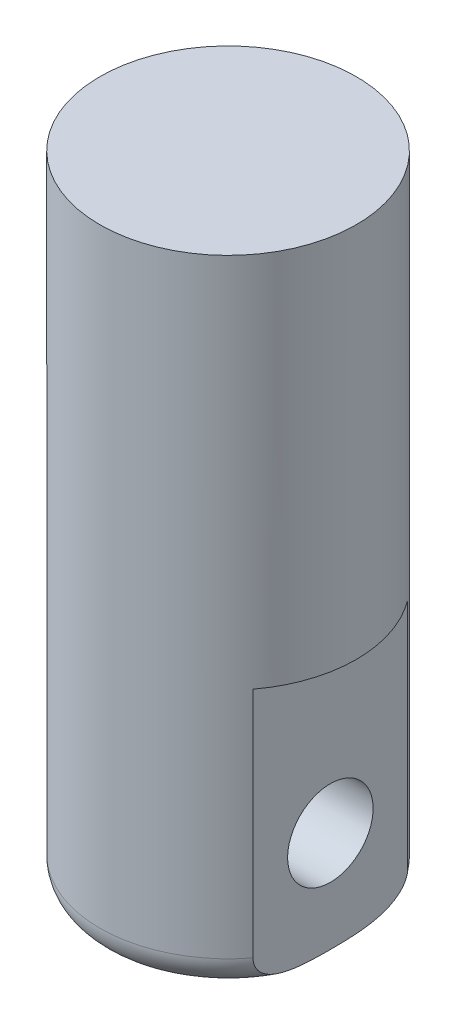
ISO-10303-21;
HEADER;
FILE_DESCRIPTION(('STEP AP214'),'2;1');
FILE_NAME('part.step','',(''),(''),'','','');
FILE_SCHEMA(('AUTOMOTIVE_DESIGN { 1 0 10303 214 1 1 1 1 }'));
ENDSEC;
DATA;
#1=APPLICATION_CONTEXT('core data for automotive mechanical design processes');
#2=APPLICATION_PROTOCOL_DEFINITION('international standard','automotive_design',2000,#1);
#3=PRODUCT_CONTEXT('',#1,'mechanical');
#4=PRODUCT('Part','Part','',(#3));
#5=PRODUCT_RELATED_PRODUCT_CATEGORY('part','',(#4));
#6=PRODUCT_DEFINITION_FORMATION('','',#4);
#7=PRODUCT_DEFINITION_CONTEXT('part definition',#1,'design');
#8=PRODUCT_DEFINITION('design','',#6,#7);
#9=PRODUCT_DEFINITION_SHAPE('','',#8);
#10=(LENGTH_UNIT() NAMED_UNIT(*) SI_UNIT(.MILLI.,.METRE.));
#11=(NAMED_UNIT(*) PLANE_ANGLE_UNIT() SI_UNIT($,.RADIAN.));
#12=(NAMED_UNIT(*) SI_UNIT($,.STERADIAN.) SOLID_ANGLE_UNIT());
#13=UNCERTAINTY_MEASURE_WITH_UNIT(LENGTH_MEASURE(1.E-05),#10,'distance_accuracy_value','');
#14=(GEOMETRIC_REPRESENTATION_CONTEXT(3) GLOBAL_UNCERTAINTY_ASSIGNED_CONTEXT((#13)) GLOBAL_UNIT_ASSIGNED_CONTEXT((#10,
#11,#12)) REPRESENTATION_CONTEXT('',''));
#15=CARTESIAN_POINT('',(0.,0.,0.));
#16=DIRECTION('',(0.,0.,1.));
#17=DIRECTION('',(1.,0.,0.));
#18=AXIS2_PLACEMENT_3D('',#15,#16,#17);
#19=CARTESIAN_POINT('',(0.,60.,0.));
#20=DIRECTION('',(0.,-1.,0.));
#21=DIRECTION('',(0.,0.,-1.));
#22=AXIS2_PLACEMENT_3D('',#19,#20,#21);
#23=CYLINDRICAL_SURFACE('',#22,12.);
#24=CARTESIAN_POINT('',(0.,24.7728953416858,0.));
#25=DIRECTION('',(0.,1.,0.));
#26=DIRECTION('',(0.,0.,1.));
#27=AXIS2_PLACEMENT_3D('',#24,#25,#26);
#28=CIRCLE('',#27,12.);
#29=CARTESIAN_POINT('',(9.57123656336734,24.7728953416858,7.2381924986878));
#30=VERTEX_POINT('',#29);
#31=CARTESIAN_POINT('',(9.57123656336734,24.7728953416858,-7.2381924986878));
#32=VERTEX_POINT('',#31);
#33=EDGE_CURVE('E13',#30,#32,#28,.T.);
#34=ORIENTED_EDGE('',*,*,#33,.T.);
#35=DIRECTION('',(0.,-1.,0.));
#36=VECTOR('',#35,1.);
#37=CARTESIAN_POINT('',(9.57123656336734,60.,-7.23819249868779));
#38=LINE('',#37,#36);
#39=CARTESIAN_POINT('',(9.57123656336733,3.,-7.2381924986878));
#40=VERTEX_POINT('',#39);
#41=EDGE_CURVE('E86',#32,#40,#38,.T.);
#42=ORIENTED_EDGE('',*,*,#41,.T.);
#43=CARTESIAN_POINT('',(0.,3.,0.));
#44=DIRECTION('',(0.,1.,0.));
#45=DIRECTION('',(0.,0.,1.));
#46=AXIS2_PLACEMENT_3D('',#43,#44,#45);
#47=CIRCLE('',#46,12.);
#48=CARTESIAN_POINT('',(-9.57123656336733,3.,-7.2381924986878));
#49=VERTEX_POINT('',#48);
#50=EDGE_CURVE('E68',#40,#49,#47,.T.);
#51=ORIENTED_EDGE('',*,*,#50,.T.);
#52=DIRECTION('',(0.,-1.,0.));
#53=VECTOR('',#52,1.);
#54=CARTESIAN_POINT('',(-9.57123656336734,60.,-7.23819249868779));
#55=LINE('',#54,#53);
#56=CARTESIAN_POINT('',(-9.57123656336734,24.7728953416858,-7.23819249868779));
#57=VERTEX_POINT('',#56);
#58=EDGE_CURVE('E106',#49,#57,#55,.F.);
#59=ORIENTED_EDGE('',*,*,#58,.T.);
#60=CARTESIAN_POINT('',(0.,24.7728953416858,0.));
#61=DIRECTION('',(0.,1.,0.));
#62=DIRECTION('',(0.,0.,1.));
#63=AXIS2_PLACEMENT_3D('',#60,#61,#62);
#64=CIRCLE('',#63,12.);
#65=CARTESIAN_POINT('',(-9.57123656336734,24.7728953416858,7.23819249868779));
#66=VERTEX_POINT('',#65);
#67=EDGE_CURVE('E122',#57,#66,#64,.T.);
#68=ORIENTED_EDGE('',*,*,#67,.T.);
#69=DIRECTION('',(0.,-1.,0.));
#70=VECTOR('',#69,1.);
#71=CARTESIAN_POINT('',(-9.57123656336734,60.,7.23819249868779));
#72=LINE('',#71,#70);
#73=CARTESIAN_POINT('',(-9.57123656336733,3.,7.2381924986878));
#74=VERTEX_POINT('',#73);
#75=EDGE_CURVE('E108',#66,#74,#72,.T.);
#76=ORIENTED_EDGE('',*,*,#75,.T.);
#77=CARTESIAN_POINT('',(9.57123656336733,3.,7.2381924986878));
#78=VERTEX_POINT('',#77);
#79=EDGE_CURVE('E100',#74,#78,#47,.T.);
#80=ORIENTED_EDGE('',*,*,#79,.T.);
#81=DIRECTION('',(0.,-1.,0.));
#82=VECTOR('',#81,1.);
#83=CARTESIAN_POINT('',(9.57123656336734,60.,7.23819249868779));
#84=LINE('',#83,#82);
#85=EDGE_CURVE('E60',#78,#30,#84,.F.);
#86=ORIENTED_EDGE('',*,*,#85,.T.);
#87=EDGE_LOOP('',(#34,#42,#51,#59,#68,#76,#80,#86));
#88=FACE_BOUND('',#87,.T.);
#89=CARTESIAN_POINT('',(0.,60.,0.));
#90=DIRECTION('',(0.,1.,0.));
#91=DIRECTION('',(0.,0.,1.));
#92=AXIS2_PLACEMENT_3D('',#89,#90,#91);
#93=CIRCLE('',#92,12.);
#94=CARTESIAN_POINT('',(0.,60.,12.));
#95=VERTEX_POINT('',#94);
#96=EDGE_CURVE('E110',#95,#95,#93,.T.);
#97=ORIENTED_EDGE('',*,*,#96,.F.);
#98=EDGE_LOOP('',(#97));
#99=FACE_BOUND('',#98,.T.);
#100=ADVANCED_FACE('F43',(#88,#99),#23,.T.);
#101=CARTESIAN_POINT('',(0.,60.,0.));
#102=DIRECTION('',(0.,1.,0.));
#103=DIRECTION('',(0.,0.,1.));
#104=AXIS2_PLACEMENT_3D('',#101,#102,#103);
#105=PLANE('',#104);
#106=ORIENTED_EDGE('',*,*,#96,.T.);
#107=EDGE_LOOP('',(#106));
#108=FACE_BOUND('',#107,.T.);
#109=ADVANCED_FACE('F132',(#108),#105,.T.);
#110=CARTESIAN_POINT('',(0.,0.,0.));
#111=DIRECTION('',(0.,1.,0.));
#112=DIRECTION('',(0.,0.,1.));
#113=AXIS2_PLACEMENT_3D('',#110,#111,#112);
#114=PLANE('',#113);
#115=CARTESIAN_POINT('',(0.,0.,0.));
#116=DIRECTION('',(0.,1.,0.));
#117=DIRECTION('',(0.,0.,1.));
#118=AXIS2_PLACEMENT_3D('',#115,#116,#117);
#119=CIRCLE('',#118,9.);
#120=CARTESIAN_POINT('',(0.,0.,9.));
#121=VERTEX_POINT('',#120);
#122=EDGE_CURVE('E114',#121,#121,#119,.F.);
#123=ORIENTED_EDGE('',*,*,#122,.T.);
#124=EDGE_LOOP('',(#123));
#125=FACE_BOUND('',#124,.T.);
#126=ADVANCED_FACE('F135',(#125),#114,.F.);
#127=CARTESIAN_POINT('',(0.,3.,0.));
#128=DIRECTION('',(0.,1.,0.));
#129=DIRECTION('',(0.,0.,1.));
#130=AXIS2_PLACEMENT_3D('',#127,#128,#129);
#131=TOROIDAL_SURFACE('',#130,9.,3.);
#132=CARTESIAN_POINT('',(9.57123656336733,0.0548873045887925,0.));
#133=CARTESIAN_POINT('',(9.57123656336733,0.0548869468945749,-0.155465034929481));
#134=CARTESIAN_POINT('',(9.57123656336733,0.0556147680681275,-0.310930133099451));
#135=CARTESIAN_POINT('',(9.57123656336733,0.058610709002801,-0.62184773540606));
#136=CARTESIAN_POINT('',(9.57123656336733,0.0608788458463625,-0.777300239383904));
#137=CARTESIAN_POINT('',(9.57123656336733,0.0672121364854791,-1.08822388517824));
#138=CARTESIAN_POINT('',(9.57123656336733,0.0712779133085758,-1.24369501475731));
#139=CARTESIAN_POINT('',(9.57123656336733,0.0816285158465251,-1.55457008641294));
#140=CARTESIAN_POINT('',(9.57123656336733,0.0879134028516704,-1.70997402651507));
#141=CARTESIAN_POINT('',(9.57123656336733,0.103276245255734,-2.02044593965249));
#142=CARTESIAN_POINT('',(9.57123656336733,0.112350572036839,-2.17551408712386));
#143=CARTESIAN_POINT('',(9.57123656336733,0.134033508303668,-2.48539847302015));
#144=CARTESIAN_POINT('',(9.57123656336733,0.146641868484907,-2.64021472843995));
#145=CARTESIAN_POINT('',(9.57123656336733,0.176279036230797,-2.94933060029504));
#146=CARTESIAN_POINT('',(9.57123656336733,0.193304951945146,-3.10363048807499));
#147=CARTESIAN_POINT('',(9.57123656336733,0.23282988250685,-3.41151750344136));
#148=CARTESIAN_POINT('',(9.57123656336733,0.255328006068026,-3.56510474295315));
#149=CARTESIAN_POINT('',(9.57123656336733,0.30074241429041,-3.83400419968946));
#150=CARTESIAN_POINT('',(9.57123656336733,0.322230575740359,-3.94955442035602));
#151=CARTESIAN_POINT('',(9.57123656336733,0.369643686131024,-4.17973425821697));
#152=CARTESIAN_POINT('',(9.57123656336733,0.395568890279045,-4.29436382206028));
#153=CARTESIAN_POINT('',(9.57123656336733,0.481056115865391,-4.63674663826659));
#154=CARTESIAN_POINT('',(9.57123656336733,0.548289047789931,-4.86273473418383));
#155=CARTESIAN_POINT('',(9.57123656336733,0.669394620667852,-5.19581672353117));
#156=CARTESIAN_POINT('',(9.57123656336733,0.713453557515262,-5.30648246857109));
#157=CARTESIAN_POINT('',(9.57123656336733,0.80920030673028,-5.52445069679091));
#158=CARTESIAN_POINT('',(9.57123656336733,0.860889877186831,-5.63175239797343));
#159=CARTESIAN_POINT('',(9.57123656336733,1.0285319995107,-5.94637714385166));
#160=CARTESIAN_POINT('',(9.57123656336733,1.15738658111845,-6.14738563068559));
#161=CARTESIAN_POINT('',(9.57123656336733,1.39081637504733,-6.43671801111573));
#162=CARTESIAN_POINT('',(9.57123656336733,1.48170174257977,-6.53611649147816));
#163=CARTESIAN_POINT('',(9.57123656336733,1.67717269858274,-6.72068413664232));
#164=CARTESIAN_POINT('',(9.57123656336733,1.78175762185569,-6.80585399187461));
#165=CARTESIAN_POINT('',(9.57123656336733,2.00546907953204,-6.95799869140096));
#166=CARTESIAN_POINT('',(9.57123656336733,2.12475342640024,-7.02474566261939));
#167=CARTESIAN_POINT('',(9.57123656336733,2.37426860925152,-7.13310714426173));
#168=CARTESIAN_POINT('',(9.57123656336733,2.50448044669186,-7.17476428520775));
#169=CARTESIAN_POINT('',(9.57123656336733,2.75158403542274,-7.22478501770622));
#170=CARTESIAN_POINT('',(9.57123656336733,2.86767866594206,-7.23709235136449));
#171=CARTESIAN_POINT('',(9.57123656336733,3.10005546404701,-7.23914881502486));
#172=CARTESIAN_POINT('',(9.57123656336733,3.21633753299819,-7.22890736899095));
#173=CARTESIAN_POINT('',(9.57123656336733,3.43130489371198,-7.18930968998276));
#174=CARTESIAN_POINT('',(9.57123656336733,3.53044683218177,-7.162353049238));
#175=CARTESIAN_POINT('',(9.57123656336733,3.7232865338967,-7.09337228616591));
#176=CARTESIAN_POINT('',(9.57123656336733,3.81698337974559,-7.05134563332673));
#177=CARTESIAN_POINT('',(9.57123656336733,4.02728987625577,-6.9383445281493));
#178=CARTESIAN_POINT('',(9.57123656336733,4.14122331365471,-6.86239298587672));
#179=CARTESIAN_POINT('',(9.57123656336733,4.35524319531788,-6.69299161072007));
#180=CARTESIAN_POINT('',(9.57123656336733,4.4553010163791,-6.59950651608131));
#181=CARTESIAN_POINT('',(9.57123656336733,4.6828352021093,-6.35543499253282));
#182=CARTESIAN_POINT('',(9.57123656336733,4.80281467127765,-6.19790199702743));
#183=CARTESIAN_POINT('',(9.57123656336733,5.0169389247307,-5.86644967115346));
#184=CARTESIAN_POINT('',(9.57123656336733,5.11104774080221,-5.69250797408939));
#185=CARTESIAN_POINT('',(9.57123656336733,5.26781049515735,-5.35562570942427));
#186=CARTESIAN_POINT('',(9.57123656336733,5.33285327900349,-5.19376932669487));
#187=CARTESIAN_POINT('',(9.57123656336733,5.4487798339006,-4.86499125249198));
#188=CARTESIAN_POINT('',(9.57123656336733,5.49965122148184,-4.69806527138069));
#189=CARTESIAN_POINT('',(9.57123656336733,5.58981406735646,-4.36051115551184));
#190=CARTESIAN_POINT('',(9.57123656336733,5.62906157774781,-4.18987152449352));
#191=CARTESIAN_POINT('',(9.57123656336733,5.69789910256991,-3.84677066206798));
#192=CARTESIAN_POINT('',(9.57123656336733,5.72749308353992,-3.67431020896585));
#193=CARTESIAN_POINT('',(9.57123656336733,5.78510852284045,-3.28682809243664));
#194=CARTESIAN_POINT('',(9.57123656336733,5.81105638626106,-3.07150401460776));
#195=CARTESIAN_POINT('',(9.57123656336733,5.85410003409309,-2.63995120368985));
#196=CARTESIAN_POINT('',(9.57123656336733,5.87119307280183,-2.42372221093166));
#197=CARTESIAN_POINT('',(9.57123656336733,5.89894060207656,-1.99059121410096));
#198=CARTESIAN_POINT('',(9.57123656336733,5.90958678783062,-1.77368870219643));
#199=CARTESIAN_POINT('',(9.57123656336733,5.92622753637672,-1.33974155278282));
#200=CARTESIAN_POINT('',(9.57123656336733,5.93222263136633,-1.12269693437948));
#201=CARTESIAN_POINT('',(9.57123656336733,5.94076928440678,-0.688773218968006));
#202=CARTESIAN_POINT('',(9.57123656336733,5.94332446402743,-0.471894188511615));
#203=CARTESIAN_POINT('',(9.57123656336733,5.94557932523587,-0.0381136365999576));
#204=CARTESIAN_POINT('',(9.57123656336733,5.94527889230539,0.178787885408469));
#205=CARTESIAN_POINT('',(9.57123656336733,5.94175293817275,0.612401954389633));
#206=CARTESIAN_POINT('',(9.57123656336733,5.93852966422165,0.829114518531596));
#207=CARTESIAN_POINT('',(9.57123656336733,5.92845088472742,1.26244881750686));
#208=CARTESIAN_POINT('',(9.57123656336733,5.92159559944424,1.47907055705097));
#209=CARTESIAN_POINT('',(9.57123656336733,5.90419112467362,1.88241021187354));
#210=CARTESIAN_POINT('',(9.57123656336733,5.89427755465742,2.06915448114591));
#211=CARTESIAN_POINT('',(9.57123656336733,5.86951964401144,2.44235256295408));
#212=CARTESIAN_POINT('',(9.57123656336733,5.85467466454596,2.62880633471186));
#213=CARTESIAN_POINT('',(9.57123656336733,5.81844858039667,3.00172512489686));
#214=CARTESIAN_POINT('',(9.57123656336733,5.79704587379113,3.18818811297136));
#215=CARTESIAN_POINT('',(9.57123656336733,5.74582185649993,3.55996271792475));
#216=CARTESIAN_POINT('',(9.57123656336733,5.71600159404551,3.74527447523071));
#217=CARTESIAN_POINT('',(9.57123656336733,5.64499241138803,4.1175224300438));
#218=CARTESIAN_POINT('',(9.57123656336733,5.60359231014543,4.30441938159472));
#219=CARTESIAN_POINT('',(9.57123656336733,5.50683466153473,4.67480048456277));
#220=CARTESIAN_POINT('',(9.57123656336733,5.45146725283898,4.85828212597761));
#221=CARTESIAN_POINT('',(9.57123656336733,5.32400001227893,5.21792382950444));
#222=CARTESIAN_POINT('',(9.57123656336733,5.25202782186823,5.39412823065967));
#223=CARTESIAN_POINT('',(9.57123656336733,5.08765546199639,5.73657716177261));
#224=CARTESIAN_POINT('',(9.57123656336733,4.99530086253494,5.90284287459246));
#225=CARTESIAN_POINT('',(9.57123656336733,4.81541806351657,6.1758021527505));
#226=CARTESIAN_POINT('',(9.57123656336733,4.73362542848003,6.28624948169647));
#227=CARTESIAN_POINT('',(9.57123656336733,4.55619465318763,6.49573719016119));
#228=CARTESIAN_POINT('',(9.57123656336733,4.46054718124038,6.59476980011118));
#229=CARTESIAN_POINT('',(9.57123656336733,4.25388005018088,6.77793323258558));
#230=CARTESIAN_POINT('',(9.57123656336733,4.1427093432075,6.86189643283234));
#231=CARTESIAN_POINT('',(9.57123656336733,3.90680394911073,7.00796180897484));
#232=CARTESIAN_POINT('',(9.57123656336733,3.78209706195883,7.07010772030341));
#233=CARTESIAN_POINT('',(9.57123656336733,3.55435839597291,7.15513298598966));
#234=CARTESIAN_POINT('',(9.57123656336733,3.45352112243432,7.18390664839599));
#235=CARTESIAN_POINT('',(9.57123656336733,3.24843269052443,7.22406590392432));
#236=CARTESIAN_POINT('',(9.57123656336733,3.14418355219997,7.23546160229022));
#237=CARTESIAN_POINT('',(9.57123656336733,2.93514238525899,7.24005398312467));
#238=CARTESIAN_POINT('',(9.57123656336733,2.830349812089,7.23322596110621));
#239=CARTESIAN_POINT('',(9.57123656336733,2.62347033564214,7.20182205395067));
#240=CARTESIAN_POINT('',(9.57123656336733,2.52138412756553,7.17724165358338));
#241=CARTESIAN_POINT('',(9.57123656336733,2.323519192768,7.11229790826293));
#242=CARTESIAN_POINT('',(9.57123656336733,2.22768936113531,7.07208820044973));
#243=CARTESIAN_POINT('',(9.57123656336733,2.04296647667146,6.97813246341967));
#244=CARTESIAN_POINT('',(9.57123656336733,1.95407658050823,6.92438032079927));
#245=CARTESIAN_POINT('',(9.57123656336733,1.74400895262742,6.77768182991345));
#246=CARTESIAN_POINT('',(9.57123656336733,1.62738767797907,6.67820938410202));
#247=CARTESIAN_POINT('',(9.57123656336733,1.41156324732965,6.46188201464858));
#248=CARTESIAN_POINT('',(9.57123656336733,1.31239814415734,6.3449901171901));
#249=CARTESIAN_POINT('',(9.57123656336733,1.15175306193868,6.12800409987122));
#250=CARTESIAN_POINT('',(9.57123656336733,1.08688145656462,6.03036592215077));
#251=CARTESIAN_POINT('',(9.57123656336733,0.965916382905104,5.82974721744432));
#252=CARTESIAN_POINT('',(9.57123656336733,0.909828124138755,5.72676356783418));
#253=CARTESIAN_POINT('',(9.57123656336733,0.805533349225967,5.51670658292409));
#254=CARTESIAN_POINT('',(9.57123656336733,0.757340085340285,5.40962673601947));
#255=CARTESIAN_POINT('',(9.57123656336733,0.668094553830139,5.19258846850228));
#256=CARTESIAN_POINT('',(9.57123656336733,0.627040595404719,5.08263073657556));
#257=CARTESIAN_POINT('',(9.57123656336733,0.541288057053114,4.83143628796456));
#258=CARTESIAN_POINT('',(9.57123656336733,0.498460435216003,4.68956383616304));
#259=CARTESIAN_POINT('',(9.57123656336733,0.421327224394289,4.40349423588553));
#260=CARTESIAN_POINT('',(9.57123656336733,0.387025465209716,4.25929607356403));
#261=CARTESIAN_POINT('',(9.57123656336733,0.325559005579673,3.96913781014838));
#262=CARTESIAN_POINT('',(9.57123656336733,0.298407179432082,3.82317501908728));
#263=CARTESIAN_POINT('',(9.57123656336733,0.250122678153026,3.53029484060054));
#264=CARTESIAN_POINT('',(9.57123656336733,0.228989174903998,3.38337758735658));
#265=CARTESIAN_POINT('',(9.57123656336733,0.191611169023226,3.08837184429622));
#266=CARTESIAN_POINT('',(9.57123656336733,0.175385365143539,2.94028102746134));
#267=CARTESIAN_POINT('',(9.57123656336733,0.147002954139029,2.64370421200072));
#268=CARTESIAN_POINT('',(9.57123656336733,0.134846724728855,2.49521817798165));
#269=CARTESIAN_POINT('',(9.57123656336733,0.113821800153734,2.19815597700439));
#270=CARTESIAN_POINT('',(9.57123656336733,0.1049500920286,2.0495800185044));
#271=CARTESIAN_POINT('',(9.57123656336733,0.0898250158811562,1.75229321203448));
#272=CARTESIAN_POINT('',(9.57123656336733,0.0835717474537837,1.60358235914927));
#273=CARTESIAN_POINT('',(9.57123656336733,0.0698512339566025,1.21228114313474));
#274=CARTESIAN_POINT('',(9.57123656336733,0.0641054354523986,0.969630785971502));
#275=CARTESIAN_POINT('',(9.57123656336733,0.0585027123010042,0.605803477291543));
#276=CARTESIAN_POINT('',(9.57123656336733,0.057137695192107,0.484644412349577));
#277=CARTESIAN_POINT('',(9.57123656336733,0.0553301490558536,0.242323577542901));
#278=CARTESIAN_POINT('',(9.57123656336733,0.054887583358087,0.1211618079772));
#279=CARTESIAN_POINT('',(9.57123656336733,0.0548873045887925,0.));
#280=B_SPLINE_CURVE_WITH_KNOTS('',3,(#132,#133,#134,#135,#136,#137,#138,#139,#140,#141,#142,
#143,#144,#145,#146,#147,#148,#149,#150,#151,#152,#153,#154,#155,#156,#157,#158,#159,#160,#161,
#162,#163,#164,#165,#166,#167,#168,#169,#170,#171,#172,#173,#174,#175,#176,#177,#178,#179,#180,
#181,#182,#183,#184,#185,#186,#187,#188,#189,#190,#191,#192,#193,#194,#195,#196,#197,#198,#199,
#200,#201,#202,#203,#204,#205,#206,#207,#208,#209,#210,#211,#212,#213,#214,#215,#216,#217,#218,
#219,#220,#221,#222,#223,#224,#225,#226,#227,#228,#229,#230,#231,#232,#233,#234,#235,#236,#237,
#238,#239,#240,#241,#242,#243,#244,#245,#246,#247,#248,#249,#250,#251,#252,#253,#254,#255,#256,
#257,#258,#259,#260,#261,#262,#263,#264,#265,#266,#267,#268,#269,#270,#271,#272,#273,#274,#275,
#276,#277,#278,#279),.UNSPECIFIED.,.T.,.F.,(4,2,2,2,2,2,2,2,2,2,2,2,2,2,2,2,2,2,2,2,2,2,2,2,2,2,
2,2,2,2,2,2,2,2,2,2,2,2,2,2,2,2,2,2,2,2,2,2,2,2,2,2,2,2,2,2,2,2,2,2,2,2,2,2,2,2,2,2,2,2,2,2,2,
4),(0.,0.466393381617356,0.932791935724735,1.39935226149023,1.86592547433828,2.33189429977382,
2.79783026222237,3.26346197669504,3.72901790209985,4.08152503261637,4.43405244525598,
5.13989258780793,5.49696215872973,5.85411412682743,6.56538352288026,6.96831512642957,
7.37122717242161,7.77891975409059,8.18591765024838,8.53405386731957,8.88204461308722,
9.1889490901993,9.49590512595425,9.90442303645445,10.3137715029461,10.9045085482268,
11.4960627941657,12.018600174488,12.5415927443797,13.0665381317388,13.5912675517626,
14.2416515934753,14.892237185639,15.5436590867008,16.1950064383037,16.8456675086412,
17.4963546724678,18.1465419737536,18.79668984955,19.3576639080674,19.9187106658996,
20.4816258174434,21.0444709005327,21.6183373238244,22.1926100531389,22.7626073332033,
23.3313429233438,23.7427082164863,24.1543518773097,24.5703234966747,24.9854564234077,
25.2986781090407,25.6117175874777,25.9251816447726,26.2387254582008,26.5492620375326,
26.8599390530366,27.3172138980691,27.7754735373474,28.1266687753793,28.478071529408,
28.830058222264,29.1819614402847,29.6262156088736,30.0706689763336,30.5159172453463,
30.9611042188332,31.4079666239271,31.8548704927447,32.3013633855094,32.7478732595296,
33.4759742261242,33.8394727576124,34.2029568385891),.UNSPECIFIED.);
#281=EDGE_CURVE('E53',#78,#40,#280,.T.);
#282=ORIENTED_EDGE('',*,*,#281,.F.);
#283=ORIENTED_EDGE('',*,*,#79,.F.);
#284=CARTESIAN_POINT('',(-9.57123656336733,0.0548873045887925,0.));
#285=CARTESIAN_POINT('',(-9.57123656336733,0.0548869468945749,0.155465034929481));
#286=CARTESIAN_POINT('',(-9.57123656336733,0.0556147680681275,0.310930133099451));
#287=CARTESIAN_POINT('',(-9.57123656336733,0.058610709002801,0.62184773540606));
#288=CARTESIAN_POINT('',(-9.57123656336733,0.0608788458463625,0.777300239383904));
#289=CARTESIAN_POINT('',(-9.57123656336733,0.0672121364854791,1.08822388517824));
#290=CARTESIAN_POINT('',(-9.57123656336733,0.0712779133085758,1.24369501475731));
#291=CARTESIAN_POINT('',(-9.57123656336733,0.0816285158465251,1.55457008641294));
#292=CARTESIAN_POINT('',(-9.57123656336733,0.0879134028516704,1.70997402651507));
#293=CARTESIAN_POINT('',(-9.57123656336733,0.103276245255734,2.02044593965249));
#294=CARTESIAN_POINT('',(-9.57123656336733,0.112350572036839,2.17551408712386));
#295=CARTESIAN_POINT('',(-9.57123656336733,0.134033508303668,2.48539847302015));
#296=CARTESIAN_POINT('',(-9.57123656336733,0.146641868484907,2.64021472843995));
#297=CARTESIAN_POINT('',(-9.57123656336733,0.176279036230797,2.94933060029504));
#298=CARTESIAN_POINT('',(-9.57123656336733,0.193304951945146,3.10363048807499));
#299=CARTESIAN_POINT('',(-9.57123656336733,0.23282988250685,3.41151750344136));
#300=CARTESIAN_POINT('',(-9.57123656336733,0.255328006068026,3.56510474295315));
#301=CARTESIAN_POINT('',(-9.57123656336733,0.30074241429041,3.83400419968946));
#302=CARTESIAN_POINT('',(-9.57123656336733,0.322230575740359,3.94955442035602));
#303=CARTESIAN_POINT('',(-9.57123656336733,0.369643686131024,4.17973425821697));
#304=CARTESIAN_POINT('',(-9.57123656336733,0.395568890279045,4.29436382206028));
#305=CARTESIAN_POINT('',(-9.57123656336733,0.481056115865391,4.63674663826659));
#306=CARTESIAN_POINT('',(-9.57123656336733,0.548289047789931,4.86273473418383));
#307=CARTESIAN_POINT('',(-9.57123656336733,0.669394620667852,5.19581672353117));
#308=CARTESIAN_POINT('',(-9.57123656336733,0.713453557515262,5.30648246857109));
#309=CARTESIAN_POINT('',(-9.57123656336733,0.80920030673028,5.52445069679091));
#310=CARTESIAN_POINT('',(-9.57123656336733,0.860889877186831,5.63175239797343));
#311=CARTESIAN_POINT('',(-9.57123656336733,1.0285319995107,5.94637714385166));
#312=CARTESIAN_POINT('',(-9.57123656336733,1.15738658111845,6.14738563068559));
#313=CARTESIAN_POINT('',(-9.57123656336733,1.39081637504733,6.43671801111573));
#314=CARTESIAN_POINT('',(-9.57123656336733,1.48170174257977,6.53611649147816));
#315=CARTESIAN_POINT('',(-9.57123656336733,1.67717269858274,6.72068413664232));
#316=CARTESIAN_POINT('',(-9.57123656336733,1.78175762185569,6.80585399187461));
#317=CARTESIAN_POINT('',(-9.57123656336733,2.00546907953204,6.95799869140096));
#318=CARTESIAN_POINT('',(-9.57123656336733,2.12475342640024,7.02474566261939));
#319=CARTESIAN_POINT('',(-9.57123656336733,2.37426860925152,7.13310714426173));
#320=CARTESIAN_POINT('',(-9.57123656336733,2.50448044669186,7.17476428520775));
#321=CARTESIAN_POINT('',(-9.57123656336733,2.75158403542274,7.22478501770622));
#322=CARTESIAN_POINT('',(-9.57123656336733,2.86767866594206,7.23709235136449));
#323=CARTESIAN_POINT('',(-9.57123656336733,3.10005546404701,7.23914881502486));
#324=CARTESIAN_POINT('',(-9.57123656336733,3.21633753299819,7.22890736899095));
#325=CARTESIAN_POINT('',(-9.57123656336733,3.43130489371198,7.18930968998276));
#326=CARTESIAN_POINT('',(-9.57123656336733,3.53044683218177,7.162353049238));
#327=CARTESIAN_POINT('',(-9.57123656336733,3.7232865338967,7.09337228616591));
#328=CARTESIAN_POINT('',(-9.57123656336733,3.81698337974559,7.05134563332673));
#329=CARTESIAN_POINT('',(-9.57123656336733,4.02728987625577,6.9383445281493));
#330=CARTESIAN_POINT('',(-9.57123656336733,4.14122331365471,6.86239298587672));
#331=CARTESIAN_POINT('',(-9.57123656336733,4.35524319531788,6.69299161072007));
#332=CARTESIAN_POINT('',(-9.57123656336733,4.4553010163791,6.59950651608131));
#333=CARTESIAN_POINT('',(-9.57123656336733,4.6828352021093,6.35543499253282));
#334=CARTESIAN_POINT('',(-9.57123656336733,4.80281467127765,6.19790199702743));
#335=CARTESIAN_POINT('',(-9.57123656336733,5.0169389247307,5.86644967115346));
#336=CARTESIAN_POINT('',(-9.57123656336733,5.11104774080221,5.69250797408939));
#337=CARTESIAN_POINT('',(-9.57123656336733,5.26781049515735,5.35562570942427));
#338=CARTESIAN_POINT('',(-9.57123656336733,5.33285327900349,5.19376932669487));
#339=CARTESIAN_POINT('',(-9.57123656336733,5.4487798339006,4.86499125249198));
#340=CARTESIAN_POINT('',(-9.57123656336733,5.49965122148184,4.69806527138069));
#341=CARTESIAN_POINT('',(-9.57123656336733,5.58981406735646,4.36051115551184));
#342=CARTESIAN_POINT('',(-9.57123656336733,5.62906157774781,4.18987152449352));
#343=CARTESIAN_POINT('',(-9.57123656336733,5.69789910256991,3.84677066206798));
#344=CARTESIAN_POINT('',(-9.57123656336733,5.72749308353992,3.67431020896585));
#345=CARTESIAN_POINT('',(-9.57123656336733,5.78510852284045,3.28682809243664));
#346=CARTESIAN_POINT('',(-9.57123656336733,5.81105638626106,3.07150401460776));
#347=CARTESIAN_POINT('',(-9.57123656336733,5.85410003409309,2.63995120368985));
#348=CARTESIAN_POINT('',(-9.57123656336733,5.87119307280183,2.42372221093166));
#349=CARTESIAN_POINT('',(-9.57123656336733,5.89894060207656,1.99059121410096));
#350=CARTESIAN_POINT('',(-9.57123656336733,5.90958678783062,1.77368870219643));
#351=CARTESIAN_POINT('',(-9.57123656336733,5.92622753637672,1.33974155278282));
#352=CARTESIAN_POINT('',(-9.57123656336733,5.93222263136633,1.12269693437948));
#353=CARTESIAN_POINT('',(-9.57123656336733,5.94076928440678,0.688773218968006));
#354=CARTESIAN_POINT('',(-9.57123656336733,5.94332446402743,0.471894188511615));
#355=CARTESIAN_POINT('',(-9.57123656336733,5.94557932523587,0.0381136365999576));
#356=CARTESIAN_POINT('',(-9.57123656336733,5.94527889230539,-0.178787885408469));
#357=CARTESIAN_POINT('',(-9.57123656336733,5.94175293817275,-0.612401954389633));
#358=CARTESIAN_POINT('',(-9.57123656336733,5.93852966422165,-0.829114518531596));
#359=CARTESIAN_POINT('',(-9.57123656336733,5.92845088472742,-1.26244881750686));
#360=CARTESIAN_POINT('',(-9.57123656336733,5.92159559944424,-1.47907055705097));
#361=CARTESIAN_POINT('',(-9.57123656336733,5.90419112467362,-1.88241021187354));
#362=CARTESIAN_POINT('',(-9.57123656336733,5.89427755465742,-2.06915448114591));
#363=CARTESIAN_POINT('',(-9.57123656336733,5.86951964401144,-2.44235256295408));
#364=CARTESIAN_POINT('',(-9.57123656336733,5.85467466454596,-2.62880633471186));
#365=CARTESIAN_POINT('',(-9.57123656336733,5.81844858039667,-3.00172512489686));
#366=CARTESIAN_POINT('',(-9.57123656336733,5.79704587379113,-3.18818811297136));
#367=CARTESIAN_POINT('',(-9.57123656336733,5.74582185649993,-3.55996271792475));
#368=CARTESIAN_POINT('',(-9.57123656336733,5.71600159404551,-3.74527447523071));
#369=CARTESIAN_POINT('',(-9.57123656336733,5.64499241138803,-4.1175224300438));
#370=CARTESIAN_POINT('',(-9.57123656336733,5.60359231014543,-4.30441938159472));
#371=CARTESIAN_POINT('',(-9.57123656336733,5.50683466153473,-4.67480048456277));
#372=CARTESIAN_POINT('',(-9.57123656336733,5.45146725283898,-4.85828212597761));
#373=CARTESIAN_POINT('',(-9.57123656336733,5.32400001227893,-5.21792382950444));
#374=CARTESIAN_POINT('',(-9.57123656336733,5.25202782186823,-5.39412823065967));
#375=CARTESIAN_POINT('',(-9.57123656336733,5.08765546199639,-5.73657716177261));
#376=CARTESIAN_POINT('',(-9.57123656336733,4.99530086253494,-5.90284287459246));
#377=CARTESIAN_POINT('',(-9.57123656336733,4.81541806351657,-6.1758021527505));
#378=CARTESIAN_POINT('',(-9.57123656336733,4.73362542848003,-6.28624948169647));
#379=CARTESIAN_POINT('',(-9.57123656336733,4.55619465318763,-6.49573719016119));
#380=CARTESIAN_POINT('',(-9.57123656336733,4.46054718124038,-6.59476980011118));
#381=CARTESIAN_POINT('',(-9.57123656336733,4.25388005018088,-6.77793323258558));
#382=CARTESIAN_POINT('',(-9.57123656336733,4.1427093432075,-6.86189643283234));
#383=CARTESIAN_POINT('',(-9.57123656336733,3.90680394911073,-7.00796180897484));
#384=CARTESIAN_POINT('',(-9.57123656336733,3.78209706195883,-7.07010772030341));
#385=CARTESIAN_POINT('',(-9.57123656336733,3.55435839597291,-7.15513298598966));
#386=CARTESIAN_POINT('',(-9.57123656336733,3.45352112243432,-7.18390664839599));
#387=CARTESIAN_POINT('',(-9.57123656336733,3.24843269052443,-7.22406590392432));
#388=CARTESIAN_POINT('',(-9.57123656336733,3.14418355219997,-7.23546160229022));
#389=CARTESIAN_POINT('',(-9.57123656336733,2.93514238525899,-7.24005398312467));
#390=CARTESIAN_POINT('',(-9.57123656336733,2.830349812089,-7.23322596110621));
#391=CARTESIAN_POINT('',(-9.57123656336733,2.62347033564214,-7.20182205395067));
#392=CARTESIAN_POINT('',(-9.57123656336733,2.52138412756553,-7.17724165358338));
#393=CARTESIAN_POINT('',(-9.57123656336733,2.323519192768,-7.11229790826293));
#394=CARTESIAN_POINT('',(-9.57123656336733,2.22768936113531,-7.07208820044973));
#395=CARTESIAN_POINT('',(-9.57123656336733,2.04296647667146,-6.97813246341967));
#396=CARTESIAN_POINT('',(-9.57123656336733,1.95407658050823,-6.92438032079927));
#397=CARTESIAN_POINT('',(-9.57123656336733,1.74400895262742,-6.77768182991345));
#398=CARTESIAN_POINT('',(-9.57123656336733,1.62738767797907,-6.67820938410202));
#399=CARTESIAN_POINT('',(-9.57123656336733,1.41156324732965,-6.46188201464858));
#400=CARTESIAN_POINT('',(-9.57123656336733,1.31239814415734,-6.3449901171901));
#401=CARTESIAN_POINT('',(-9.57123656336733,1.15175306193868,-6.12800409987122));
#402=CARTESIAN_POINT('',(-9.57123656336733,1.08688145656462,-6.03036592215077));
#403=CARTESIAN_POINT('',(-9.57123656336733,0.965916382905104,-5.82974721744432));
#404=CARTESIAN_POINT('',(-9.57123656336733,0.909828124138755,-5.72676356783418));
#405=CARTESIAN_POINT('',(-9.57123656336733,0.805533349225967,-5.51670658292409));
#406=CARTESIAN_POINT('',(-9.57123656336733,0.757340085340285,-5.40962673601947));
#407=CARTESIAN_POINT('',(-9.57123656336733,0.668094553830139,-5.19258846850228));
#408=CARTESIAN_POINT('',(-9.57123656336733,0.627040595404719,-5.08263073657556));
#409=CARTESIAN_POINT('',(-9.57123656336733,0.541288057053114,-4.83143628796456));
#410=CARTESIAN_POINT('',(-9.57123656336733,0.498460435216003,-4.68956383616304));
#411=CARTESIAN_POINT('',(-9.57123656336733,0.421327224394289,-4.40349423588553));
#412=CARTESIAN_POINT('',(-9.57123656336733,0.387025465209716,-4.25929607356403));
#413=CARTESIAN_POINT('',(-9.57123656336733,0.325559005579673,-3.96913781014838));
#414=CARTESIAN_POINT('',(-9.57123656336733,0.298407179432082,-3.82317501908728));
#415=CARTESIAN_POINT('',(-9.57123656336733,0.250122678153026,-3.53029484060054));
#416=CARTESIAN_POINT('',(-9.57123656336733,0.228989174903998,-3.38337758735658));
#417=CARTESIAN_POINT('',(-9.57123656336733,0.191611169023226,-3.08837184429622));
#418=CARTESIAN_POINT('',(-9.57123656336733,0.175385365143539,-2.94028102746134));
#419=CARTESIAN_POINT('',(-9.57123656336733,0.147002954139029,-2.64370421200072));
#420=CARTESIAN_POINT('',(-9.57123656336733,0.134846724728855,-2.49521817798165));
#421=CARTESIAN_POINT('',(-9.57123656336733,0.113821800153734,-2.19815597700439));
#422=CARTESIAN_POINT('',(-9.57123656336733,0.1049500920286,-2.0495800185044));
#423=CARTESIAN_POINT('',(-9.57123656336733,0.0898250158811562,-1.75229321203448));
#424=CARTESIAN_POINT('',(-9.57123656336733,0.0835717474537837,-1.60358235914927));
#425=CARTESIAN_POINT('',(-9.57123656336733,0.0698512339566025,-1.21228114313474));
#426=CARTESIAN_POINT('',(-9.57123656336733,0.0641054354523986,-0.969630785971502));
#427=CARTESIAN_POINT('',(-9.57123656336733,0.0585027123010042,-0.605803477291543));
#428=CARTESIAN_POINT('',(-9.57123656336733,0.057137695192107,-0.484644412349577));
#429=CARTESIAN_POINT('',(-9.57123656336733,0.0553301490558536,-0.242323577542901));
#430=CARTESIAN_POINT('',(-9.57123656336733,0.054887583358087,-0.1211618079772));
#431=CARTESIAN_POINT('',(-9.57123656336733,0.0548873045887925,0.));
#432=B_SPLINE_CURVE_WITH_KNOTS('',3,(#284,#285,#286,#287,#288,#289,#290,#291,#292,#293,#294,
#295,#296,#297,#298,#299,#300,#301,#302,#303,#304,#305,#306,#307,#308,#309,#310,#311,#312,#313,
#314,#315,#316,#317,#318,#319,#320,#321,#322,#323,#324,#325,#326,#327,#328,#329,#330,#331,#332,
#333,#334,#335,#336,#337,#338,#339,#340,#341,#342,#343,#344,#345,#346,#347,#348,#349,#350,#351,
#352,#353,#354,#355,#356,#357,#358,#359,#360,#361,#362,#363,#364,#365,#366,#367,#368,#369,#370,
#371,#372,#373,#374,#375,#376,#377,#378,#379,#380,#381,#382,#383,#384,#385,#386,#387,#388,#389,
#390,#391,#392,#393,#394,#395,#396,#397,#398,#399,#400,#401,#402,#403,#404,#405,#406,#407,#408,
#409,#410,#411,#412,#413,#414,#415,#416,#417,#418,#419,#420,#421,#422,#423,#424,#425,#426,#427,
#428,#429,#430,#431),.UNSPECIFIED.,.T.,.F.,(4,2,2,2,2,2,2,2,2,2,2,2,2,2,2,2,2,2,2,2,2,2,2,2,2,2,
2,2,2,2,2,2,2,2,2,2,2,2,2,2,2,2,2,2,2,2,2,2,2,2,2,2,2,2,2,2,2,2,2,2,2,2,2,2,2,2,2,2,2,2,2,2,2,
4),(0.,0.466393381617356,0.932791935724735,1.39935226149023,1.86592547433828,2.33189429977382,
2.79783026222237,3.26346197669504,3.72901790209985,4.08152503261637,4.43405244525598,
5.13989258780793,5.49696215872973,5.85411412682743,6.56538352288026,6.96831512642957,
7.37122717242161,7.77891975409059,8.18591765024838,8.53405386731957,8.88204461308722,
9.1889490901993,9.49590512595425,9.90442303645445,10.3137715029461,10.9045085482268,
11.4960627941657,12.018600174488,12.5415927443797,13.0665381317388,13.5912675517626,
14.2416515934753,14.892237185639,15.5436590867008,16.1950064383037,16.8456675086412,
17.4963546724678,18.1465419737536,18.79668984955,19.3576639080674,19.9187106658996,
20.4816258174434,21.0444709005327,21.6183373238244,22.1926100531389,22.7626073332033,
23.3313429233438,23.7427082164863,24.1543518773097,24.5703234966747,24.9854564234077,
25.2986781090407,25.6117175874777,25.9251816447726,26.2387254582008,26.5492620375326,
26.8599390530366,27.3172138980691,27.7754735373474,28.1266687753793,28.478071529408,
28.830058222264,29.1819614402847,29.6262156088736,30.0706689763336,30.5159172453463,
30.9611042188332,31.4079666239271,31.8548704927447,32.3013633855094,32.7478732595296,
33.4759742261242,33.8394727576124,34.2029568385891),.UNSPECIFIED.);
#433=EDGE_CURVE('E117',#49,#74,#432,.T.);
#434=ORIENTED_EDGE('',*,*,#433,.F.);
#435=ORIENTED_EDGE('',*,*,#50,.F.);
#436=EDGE_LOOP('',(#282,#283,#434,#435));
#437=FACE_BOUND('',#436,.T.);
#438=ORIENTED_EDGE('',*,*,#122,.F.);
#439=EDGE_LOOP('',(#438));
#440=FACE_BOUND('',#439,.T.);
#441=ADVANCED_FACE('F45',(#437,#440),#131,.T.);
#442=CARTESIAN_POINT('',(-14.,24.7728953416858,-40.));
#443=DIRECTION('',(0.,1.,0.));
#444=DIRECTION('',(0.,0.,1.));
#445=AXIS2_PLACEMENT_3D('',#442,#443,#444);
#446=PLANE('',#445);
#447=DIRECTION('',(0.,0.,1.));
#448=VECTOR('',#447,1.);
#449=CARTESIAN_POINT('',(-9.57123656336734,24.7728953416858,-40.));
#450=LINE('',#449,#448);
#451=EDGE_CURVE('E90',#57,#66,#450,.T.);
#452=ORIENTED_EDGE('',*,*,#451,.T.);
#453=ORIENTED_EDGE('',*,*,#67,.F.);
#454=EDGE_LOOP('',(#452,#453));
#455=FACE_BOUND('',#454,.T.);
#456=ADVANCED_FACE('F129',(#455),#446,.F.);
#457=CARTESIAN_POINT('',(-9.57123656336734,24.7728953416858,-40.));
#458=DIRECTION('',(1.,0.,0.));
#459=DIRECTION('',(0.,1.,0.));
#460=AXIS2_PLACEMENT_3D('',#457,#458,#459);
#461=PLANE('',#460);
#462=CARTESIAN_POINT('',(-9.57123656336734,9.5,0.));
#463=DIRECTION('',(1.,0.,0.));
#464=DIRECTION('',(0.,1.,0.));
#465=AXIS2_PLACEMENT_3D('',#462,#463,#464);
#466=CIRCLE('',#465,4.);
#467=CARTESIAN_POINT('',(-9.57123656336734,13.5,0.));
#468=VERTEX_POINT('',#467);
#469=EDGE_CURVE('E94',#468,#468,#466,.T.);
#470=ORIENTED_EDGE('',*,*,#469,.T.);
#471=EDGE_LOOP('',(#470));
#472=FACE_BOUND('',#471,.T.);
#473=ORIENTED_EDGE('',*,*,#451,.F.);
#474=ORIENTED_EDGE('',*,*,#58,.F.);
#475=ORIENTED_EDGE('',*,*,#433,.T.);
#476=ORIENTED_EDGE('',*,*,#75,.F.);
#477=EDGE_LOOP('',(#473,#474,#475,#476));
#478=FACE_BOUND('',#477,.T.);
#479=ADVANCED_FACE('F124',(#472,#478),#461,.F.);
#480=CARTESIAN_POINT('',(14.,24.7728953416858,-40.));
#481=DIRECTION('',(0.,1.,0.));
#482=DIRECTION('',(0.,0.,1.));
#483=AXIS2_PLACEMENT_3D('',#480,#481,#482);
#484=PLANE('',#483);
#485=DIRECTION('',(0.,0.,1.));
#486=VECTOR('',#485,1.);
#487=CARTESIAN_POINT('',(9.57123656336734,24.7728953416858,-40.));
#488=LINE('',#487,#486);
#489=EDGE_CURVE('E89',#32,#30,#488,.T.);
#490=ORIENTED_EDGE('',*,*,#489,.F.);
#491=ORIENTED_EDGE('',*,*,#33,.F.);
#492=EDGE_LOOP('',(#490,#491));
#493=FACE_BOUND('',#492,.T.);
#494=ADVANCED_FACE('F93',(#493),#484,.F.);
#495=CARTESIAN_POINT('',(9.57123656336734,24.7728953416858,-40.));
#496=DIRECTION('',(-1.,0.,0.));
#497=DIRECTION('',(0.,-1.,0.));
#498=AXIS2_PLACEMENT_3D('',#495,#496,#497);
#499=PLANE('',#498);
#500=CARTESIAN_POINT('',(9.57123656336733,9.5,0.));
#501=DIRECTION('',(-1.,0.,0.));
#502=DIRECTION('',(0.,-1.,0.));
#503=AXIS2_PLACEMENT_3D('',#500,#501,#502);
#504=CIRCLE('',#503,4.);
#505=CARTESIAN_POINT('',(9.57123656336733,5.5,0.));
#506=VERTEX_POINT('',#505);
#507=EDGE_CURVE('E48',#506,#506,#504,.T.);
#508=ORIENTED_EDGE('',*,*,#507,.T.);
#509=EDGE_LOOP('',(#508));
#510=FACE_BOUND('',#509,.T.);
#511=ORIENTED_EDGE('',*,*,#489,.T.);
#512=ORIENTED_EDGE('',*,*,#85,.F.);
#513=ORIENTED_EDGE('',*,*,#281,.T.);
#514=ORIENTED_EDGE('',*,*,#41,.F.);
#515=EDGE_LOOP('',(#511,#512,#513,#514));
#516=FACE_BOUND('',#515,.T.);
#517=ADVANCED_FACE('F88',(#510,#516),#499,.F.);
#518=CARTESIAN_POINT('',(40.4287634366327,9.50000000000001,0.));
#519=DIRECTION('',(-1.,0.,0.));
#520=DIRECTION('',(0.,-1.,0.));
#521=AXIS2_PLACEMENT_3D('',#518,#519,#520);
#522=CYLINDRICAL_SURFACE('',#521,4.);
#523=ORIENTED_EDGE('',*,*,#507,.F.);
#524=EDGE_LOOP('',(#523));
#525=FACE_BOUND('',#524,.T.);
#526=ORIENTED_EDGE('',*,*,#469,.F.);
#527=EDGE_LOOP('',(#526));
#528=FACE_BOUND('',#527,.T.);
#529=ADVANCED_FACE('F178',(#525,#528),#522,.F.);
#530=CLOSED_SHELL('',(#100,#109,#126,#441,#456,#479,#494,#517,#529));
#531=MANIFOLD_SOLID_BREP('B2',#530);
#532=ADVANCED_BREP_SHAPE_REPRESENTATION('',(#18,#531),#14);
#533=SHAPE_DEFINITION_REPRESENTATION(#9,#532);
ENDSEC;
END-ISO-10303-21;
